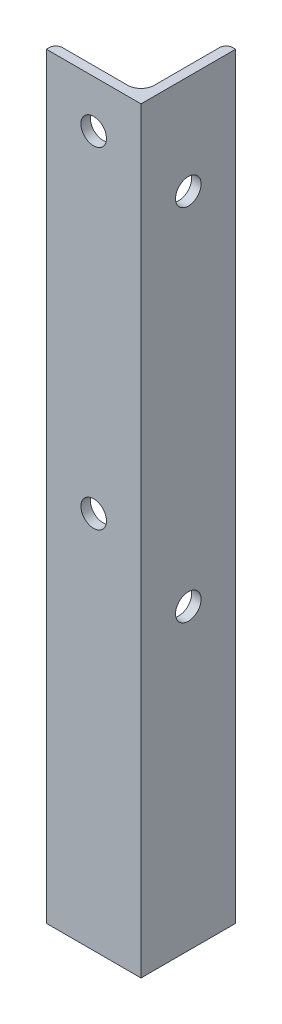
ISO-10303-21;
HEADER;
FILE_DESCRIPTION(('STEP AP214'),'2;1');
FILE_NAME('part.step','',(''),(''),'','','');
FILE_SCHEMA(('AUTOMOTIVE_DESIGN { 1 0 10303 214 1 1 1 1 }'));
ENDSEC;
DATA;
#1=APPLICATION_CONTEXT('core data for automotive mechanical design processes');
#2=APPLICATION_PROTOCOL_DEFINITION('international standard','automotive_design',2000,#1);
#3=PRODUCT_CONTEXT('',#1,'mechanical');
#4=PRODUCT('Part','Part','',(#3));
#5=PRODUCT_RELATED_PRODUCT_CATEGORY('part','',(#4));
#6=PRODUCT_DEFINITION_FORMATION('','',#4);
#7=PRODUCT_DEFINITION_CONTEXT('part definition',#1,'design');
#8=PRODUCT_DEFINITION('design','',#6,#7);
#9=PRODUCT_DEFINITION_SHAPE('','',#8);
#10=(LENGTH_UNIT() NAMED_UNIT(*) SI_UNIT(.MILLI.,.METRE.));
#11=(NAMED_UNIT(*) PLANE_ANGLE_UNIT() SI_UNIT($,.RADIAN.));
#12=(NAMED_UNIT(*) SI_UNIT($,.STERADIAN.) SOLID_ANGLE_UNIT());
#13=UNCERTAINTY_MEASURE_WITH_UNIT(LENGTH_MEASURE(1.E-05),#10,'distance_accuracy_value','');
#14=(GEOMETRIC_REPRESENTATION_CONTEXT(3) GLOBAL_UNCERTAINTY_ASSIGNED_CONTEXT((#13)) GLOBAL_UNIT_ASSIGNED_CONTEXT((#10,
#11,#12)) REPRESENTATION_CONTEXT('',''));
#15=CARTESIAN_POINT('',(0.,0.,0.));
#16=DIRECTION('',(0.,0.,1.));
#17=DIRECTION('',(1.,0.,0.));
#18=AXIS2_PLACEMENT_3D('',#15,#16,#17);
#19=CARTESIAN_POINT('',(0.,200.,0.));
#20=DIRECTION('',(-1.,0.,0.));
#21=DIRECTION('',(0.,0.,-1.));
#22=AXIS2_PLACEMENT_3D('',#19,#20,#21);
#23=PLANE('',#22);
#24=CARTESIAN_POINT('',(0.,147.5,-25.));
#25=DIRECTION('',(-1.,0.,0.));
#26=DIRECTION('',(0.,0.,1.));
#27=AXIS2_PLACEMENT_3D('',#24,#25,#26);
#28=CIRCLE('',#27,6.75);
#29=CARTESIAN_POINT('',(0.,147.5,-18.25));
#30=VERTEX_POINT('',#29);
#31=EDGE_CURVE('E218',#30,#30,#28,.T.);
#32=ORIENTED_EDGE('',*,*,#31,.T.);
#33=EDGE_LOOP('',(#32));
#34=FACE_BOUND('',#33,.T.);
#35=CARTESIAN_POINT('',(0.,-42.5,-25.));
#36=DIRECTION('',(-1.,0.,0.));
#37=DIRECTION('',(0.,0.,1.));
#38=AXIS2_PLACEMENT_3D('',#35,#36,#37);
#39=CIRCLE('',#38,6.75);
#40=CARTESIAN_POINT('',(0.,-42.5,-18.25));
#41=VERTEX_POINT('',#40);
#42=EDGE_CURVE('E221',#41,#41,#39,.T.);
#43=ORIENTED_EDGE('',*,*,#42,.T.);
#44=EDGE_LOOP('',(#43));
#45=FACE_BOUND('',#44,.T.);
#46=DIRECTION('',(0.,0.,1.));
#47=VECTOR('',#46,1.);
#48=CARTESIAN_POINT('',(0.,-200.,0.));
#49=LINE('',#48,#47);
#50=CARTESIAN_POINT('',(0.,-200.,-50.));
#51=VERTEX_POINT('',#50);
#52=CARTESIAN_POINT('',(0.,-200.,0.));
#53=VERTEX_POINT('',#52);
#54=EDGE_CURVE('E137',#51,#53,#49,.T.);
#55=ORIENTED_EDGE('',*,*,#54,.F.);
#56=DIRECTION('',(0.,-1.,0.));
#57=VECTOR('',#56,1.);
#58=CARTESIAN_POINT('',(0.,200.,-50.));
#59=LINE('',#58,#57);
#60=CARTESIAN_POINT('',(0.,200.,-50.));
#61=VERTEX_POINT('',#60);
#62=EDGE_CURVE('E136',#61,#51,#59,.T.);
#63=ORIENTED_EDGE('',*,*,#62,.F.);
#64=DIRECTION('',(0.,0.,1.));
#65=VECTOR('',#64,1.);
#66=CARTESIAN_POINT('',(0.,200.,0.));
#67=LINE('',#66,#65);
#68=CARTESIAN_POINT('',(0.,200.,0.));
#69=VERTEX_POINT('',#68);
#70=EDGE_CURVE('E159',#61,#69,#67,.T.);
#71=ORIENTED_EDGE('',*,*,#70,.T.);
#72=DIRECTION('',(0.,-1.,0.));
#73=VECTOR('',#72,1.);
#74=CARTESIAN_POINT('',(0.,200.,0.));
#75=LINE('',#74,#73);
#76=EDGE_CURVE('E11',#69,#53,#75,.T.);
#77=ORIENTED_EDGE('',*,*,#76,.T.);
#78=EDGE_LOOP('',(#55,#63,#71,#77));
#79=FACE_BOUND('',#78,.T.);
#80=ADVANCED_FACE('F35',(#34,#45,#79),#23,.F.);
#81=CARTESIAN_POINT('',(0.,200.,0.));
#82=DIRECTION('',(0.,0.,-1.));
#83=DIRECTION('',(1.,0.,0.));
#84=AXIS2_PLACEMENT_3D('',#81,#82,#83);
#85=PLANE('',#84);
#86=CARTESIAN_POINT('',(-25.,175.,0.));
#87=DIRECTION('',(0.,0.,-1.));
#88=DIRECTION('',(-1.,0.,0.));
#89=AXIS2_PLACEMENT_3D('',#86,#87,#88);
#90=CIRCLE('',#89,6.75000000000002);
#91=CARTESIAN_POINT('',(-31.75,175.,0.));
#92=VERTEX_POINT('',#91);
#93=EDGE_CURVE('E231',#92,#92,#90,.T.);
#94=ORIENTED_EDGE('',*,*,#93,.T.);
#95=EDGE_LOOP('',(#94));
#96=FACE_BOUND('',#95,.T.);
#97=CARTESIAN_POINT('',(-25.,0.,0.));
#98=DIRECTION('',(0.,0.,-1.));
#99=DIRECTION('',(-1.,0.,0.));
#100=AXIS2_PLACEMENT_3D('',#97,#98,#99);
#101=CIRCLE('',#100,6.75000000000002);
#102=CARTESIAN_POINT('',(-31.75,0.,0.));
#103=VERTEX_POINT('',#102);
#104=EDGE_CURVE('E235',#103,#103,#101,.T.);
#105=ORIENTED_EDGE('',*,*,#104,.T.);
#106=EDGE_LOOP('',(#105));
#107=FACE_BOUND('',#106,.T.);
#108=DIRECTION('',(-1.,0.,0.));
#109=VECTOR('',#108,1.);
#110=CARTESIAN_POINT('',(0.,-200.,0.));
#111=LINE('',#110,#109);
#112=CARTESIAN_POINT('',(-50.,-200.,0.));
#113=VERTEX_POINT('',#112);
#114=EDGE_CURVE('E139',#53,#113,#111,.T.);
#115=ORIENTED_EDGE('',*,*,#114,.F.);
#116=ORIENTED_EDGE('',*,*,#76,.F.);
#117=DIRECTION('',(-1.,0.,0.));
#118=VECTOR('',#117,1.);
#119=CARTESIAN_POINT('',(0.,200.,0.));
#120=LINE('',#119,#118);
#121=CARTESIAN_POINT('',(-50.,200.,0.));
#122=VERTEX_POINT('',#121);
#123=EDGE_CURVE('E92',#69,#122,#120,.T.);
#124=ORIENTED_EDGE('',*,*,#123,.T.);
#125=DIRECTION('',(0.,-1.,0.));
#126=VECTOR('',#125,1.);
#127=CARTESIAN_POINT('',(-50.,200.,0.));
#128=LINE('',#127,#126);
#129=EDGE_CURVE('E43',#122,#113,#128,.T.);
#130=ORIENTED_EDGE('',*,*,#129,.T.);
#131=EDGE_LOOP('',(#115,#116,#124,#130));
#132=FACE_BOUND('',#131,.T.);
#133=ADVANCED_FACE('F174',(#96,#107,#132),#85,.F.);
#134=CARTESIAN_POINT('',(-50.,200.,0.));
#135=DIRECTION('',(1.,0.,0.));
#136=DIRECTION('',(0.,0.,1.));
#137=AXIS2_PLACEMENT_3D('',#134,#135,#136);
#138=PLANE('',#137);
#139=DIRECTION('',(0.,0.,-1.));
#140=VECTOR('',#139,1.);
#141=CARTESIAN_POINT('',(-50.,-200.,0.));
#142=LINE('',#141,#140);
#143=CARTESIAN_POINT('',(-50.,-200.,-1.50000000000001));
#144=VERTEX_POINT('',#143);
#145=EDGE_CURVE('E143',#113,#144,#142,.T.);
#146=ORIENTED_EDGE('',*,*,#145,.F.);
#147=ORIENTED_EDGE('',*,*,#129,.F.);
#148=DIRECTION('',(0.,0.,-1.));
#149=VECTOR('',#148,1.);
#150=CARTESIAN_POINT('',(-50.,200.,0.));
#151=LINE('',#150,#149);
#152=CARTESIAN_POINT('',(-50.,200.,-1.50000000000001));
#153=VERTEX_POINT('',#152);
#154=EDGE_CURVE('E183',#122,#153,#151,.T.);
#155=ORIENTED_EDGE('',*,*,#154,.T.);
#156=DIRECTION('',(0.,-1.,0.));
#157=VECTOR('',#156,1.);
#158=CARTESIAN_POINT('',(-50.,200.,-1.50000000000001));
#159=LINE('',#158,#157);
#160=EDGE_CURVE('E169',#153,#144,#159,.T.);
#161=ORIENTED_EDGE('',*,*,#160,.T.);
#162=EDGE_LOOP('',(#146,#147,#155,#161));
#163=FACE_BOUND('',#162,.T.);
#164=ADVANCED_FACE('F202',(#163),#138,.F.);
#165=CARTESIAN_POINT('',(-46.5,200.,-1.50000000000001));
#166=DIRECTION('',(0.,-1.,0.));
#167=DIRECTION('',(0.,0.,1.));
#168=AXIS2_PLACEMENT_3D('',#165,#166,#167);
#169=CYLINDRICAL_SURFACE('',#168,3.5);
#170=CARTESIAN_POINT('',(-46.5,-200.,-1.50000000000001));
#171=DIRECTION('',(0.,-1.,0.));
#172=DIRECTION('',(0.,0.,-1.));
#173=AXIS2_PLACEMENT_3D('',#170,#171,#172);
#174=CIRCLE('',#173,3.5);
#175=CARTESIAN_POINT('',(-46.5,-200.,-5.00000000000001));
#176=VERTEX_POINT('',#175);
#177=EDGE_CURVE('E146',#144,#176,#174,.T.);
#178=ORIENTED_EDGE('',*,*,#177,.F.);
#179=ORIENTED_EDGE('',*,*,#160,.F.);
#180=CARTESIAN_POINT('',(-46.5,200.,-1.50000000000001));
#181=DIRECTION('',(0.,-1.,0.));
#182=DIRECTION('',(0.,0.,-1.));
#183=AXIS2_PLACEMENT_3D('',#180,#181,#182);
#184=CIRCLE('',#183,3.5);
#185=CARTESIAN_POINT('',(-46.5,200.,-5.00000000000001));
#186=VERTEX_POINT('',#185);
#187=EDGE_CURVE('E190',#153,#186,#184,.T.);
#188=ORIENTED_EDGE('',*,*,#187,.T.);
#189=DIRECTION('',(0.,-1.,0.));
#190=VECTOR('',#189,1.);
#191=CARTESIAN_POINT('',(-46.5,200.,-5.00000000000001));
#192=LINE('',#191,#190);
#193=EDGE_CURVE('E166',#186,#176,#192,.T.);
#194=ORIENTED_EDGE('',*,*,#193,.T.);
#195=EDGE_LOOP('',(#178,#179,#188,#194));
#196=FACE_BOUND('',#195,.T.);
#197=ADVANCED_FACE('F201',(#196),#169,.T.);
#198=CARTESIAN_POINT('',(-46.5,200.,-5.00000000000001));
#199=DIRECTION('',(0.,0.,1.));
#200=DIRECTION('',(-1.,0.,0.));
#201=AXIS2_PLACEMENT_3D('',#198,#199,#200);
#202=PLANE('',#201);
#203=CARTESIAN_POINT('',(-25.,175.,-5.));
#204=DIRECTION('',(0.,0.,-1.));
#205=DIRECTION('',(-1.,0.,0.));
#206=AXIS2_PLACEMENT_3D('',#203,#204,#205);
#207=CIRCLE('',#206,6.75000000000002);
#208=CARTESIAN_POINT('',(-31.75,175.,-5.));
#209=VERTEX_POINT('',#208);
#210=EDGE_CURVE('E140',#209,#209,#207,.F.);
#211=ORIENTED_EDGE('',*,*,#210,.T.);
#212=EDGE_LOOP('',(#211));
#213=FACE_BOUND('',#212,.T.);
#214=CARTESIAN_POINT('',(-25.,0.,-5.));
#215=DIRECTION('',(0.,0.,-1.));
#216=DIRECTION('',(-1.,0.,0.));
#217=AXIS2_PLACEMENT_3D('',#214,#215,#216);
#218=CIRCLE('',#217,6.75000000000002);
#219=CARTESIAN_POINT('',(-31.75,0.,-5.));
#220=VERTEX_POINT('',#219);
#221=EDGE_CURVE('E186',#220,#220,#218,.F.);
#222=ORIENTED_EDGE('',*,*,#221,.T.);
#223=EDGE_LOOP('',(#222));
#224=FACE_BOUND('',#223,.T.);
#225=DIRECTION('',(1.,0.,0.));
#226=VECTOR('',#225,1.);
#227=CARTESIAN_POINT('',(-46.5,-200.,-5.00000000000001));
#228=LINE('',#227,#226);
#229=CARTESIAN_POINT('',(-12.,-200.,-5.00000000000001));
#230=VERTEX_POINT('',#229);
#231=EDGE_CURVE('E149',#176,#230,#228,.T.);
#232=ORIENTED_EDGE('',*,*,#231,.F.);
#233=ORIENTED_EDGE('',*,*,#193,.F.);
#234=DIRECTION('',(1.,0.,0.));
#235=VECTOR('',#234,1.);
#236=CARTESIAN_POINT('',(-46.5,200.,-5.00000000000001));
#237=LINE('',#236,#235);
#238=CARTESIAN_POINT('',(-12.,200.,-5.00000000000001));
#239=VERTEX_POINT('',#238);
#240=EDGE_CURVE('E131',#186,#239,#237,.T.);
#241=ORIENTED_EDGE('',*,*,#240,.T.);
#242=DIRECTION('',(0.,-1.,0.));
#243=VECTOR('',#242,1.);
#244=CARTESIAN_POINT('',(-12.,200.,-5.00000000000001));
#245=LINE('',#244,#243);
#246=EDGE_CURVE('E163',#239,#230,#245,.T.);
#247=ORIENTED_EDGE('',*,*,#246,.T.);
#248=EDGE_LOOP('',(#232,#233,#241,#247));
#249=FACE_BOUND('',#248,.T.);
#250=ADVANCED_FACE('F195',(#213,#224,#249),#202,.F.);
#251=CARTESIAN_POINT('',(-12.,200.,-12.));
#252=DIRECTION('',(0.,-1.,0.));
#253=DIRECTION('',(0.,0.,1.));
#254=AXIS2_PLACEMENT_3D('',#251,#252,#253);
#255=CYLINDRICAL_SURFACE('',#254,7.);
#256=CARTESIAN_POINT('',(-12.,-200.,-12.));
#257=DIRECTION('',(0.,1.,0.));
#258=DIRECTION('',(0.,0.,1.));
#259=AXIS2_PLACEMENT_3D('',#256,#257,#258);
#260=CIRCLE('',#259,7.);
#261=CARTESIAN_POINT('',(-5.,-200.,-12.));
#262=VERTEX_POINT('',#261);
#263=EDGE_CURVE('E152',#230,#262,#260,.T.);
#264=ORIENTED_EDGE('',*,*,#263,.F.);
#265=ORIENTED_EDGE('',*,*,#246,.F.);
#266=CARTESIAN_POINT('',(-12.,200.,-12.));
#267=DIRECTION('',(0.,1.,0.));
#268=DIRECTION('',(0.,0.,1.));
#269=AXIS2_PLACEMENT_3D('',#266,#267,#268);
#270=CIRCLE('',#269,7.);
#271=CARTESIAN_POINT('',(-5.,200.,-12.));
#272=VERTEX_POINT('',#271);
#273=EDGE_CURVE('E129',#239,#272,#270,.T.);
#274=ORIENTED_EDGE('',*,*,#273,.T.);
#275=DIRECTION('',(0.,-1.,0.));
#276=VECTOR('',#275,1.);
#277=CARTESIAN_POINT('',(-5.,200.,-12.));
#278=LINE('',#277,#276);
#279=EDGE_CURVE('E123',#272,#262,#278,.T.);
#280=ORIENTED_EDGE('',*,*,#279,.T.);
#281=EDGE_LOOP('',(#264,#265,#274,#280));
#282=FACE_BOUND('',#281,.T.);
#283=ADVANCED_FACE('F199',(#282),#255,.F.);
#284=CARTESIAN_POINT('',(-4.99999999999999,200.,-46.5));
#285=DIRECTION('',(1.,0.,0.));
#286=DIRECTION('',(0.,0.,1.));
#287=AXIS2_PLACEMENT_3D('',#284,#285,#286);
#288=PLANE('',#287);
#289=CARTESIAN_POINT('',(-5.,147.5,-25.));
#290=DIRECTION('',(-1.,0.,0.));
#291=DIRECTION('',(0.,0.,1.));
#292=AXIS2_PLACEMENT_3D('',#289,#290,#291);
#293=CIRCLE('',#292,6.75);
#294=CARTESIAN_POINT('',(-5.,147.5,-18.25));
#295=VERTEX_POINT('',#294);
#296=EDGE_CURVE('E228',#295,#295,#293,.F.);
#297=ORIENTED_EDGE('',*,*,#296,.T.);
#298=EDGE_LOOP('',(#297));
#299=FACE_BOUND('',#298,.T.);
#300=CARTESIAN_POINT('',(-5.,-42.5,-25.));
#301=DIRECTION('',(-1.,0.,0.));
#302=DIRECTION('',(0.,0.,1.));
#303=AXIS2_PLACEMENT_3D('',#300,#301,#302);
#304=CIRCLE('',#303,6.75);
#305=CARTESIAN_POINT('',(-5.,-42.5,-18.25));
#306=VERTEX_POINT('',#305);
#307=EDGE_CURVE('E223',#306,#306,#304,.F.);
#308=ORIENTED_EDGE('',*,*,#307,.T.);
#309=EDGE_LOOP('',(#308));
#310=FACE_BOUND('',#309,.T.);
#311=DIRECTION('',(0.,0.,-1.));
#312=VECTOR('',#311,1.);
#313=CARTESIAN_POINT('',(-4.99999999999999,-200.,-46.5));
#314=LINE('',#313,#312);
#315=CARTESIAN_POINT('',(-4.99999999999999,-200.,-46.5));
#316=VERTEX_POINT('',#315);
#317=EDGE_CURVE('E155',#262,#316,#314,.T.);
#318=ORIENTED_EDGE('',*,*,#317,.F.);
#319=ORIENTED_EDGE('',*,*,#279,.F.);
#320=DIRECTION('',(0.,0.,-1.));
#321=VECTOR('',#320,1.);
#322=CARTESIAN_POINT('',(-4.99999999999999,200.,-46.5));
#323=LINE('',#322,#321);
#324=CARTESIAN_POINT('',(-4.99999999999999,200.,-46.5));
#325=VERTEX_POINT('',#324);
#326=EDGE_CURVE('E113',#272,#325,#323,.T.);
#327=ORIENTED_EDGE('',*,*,#326,.T.);
#328=DIRECTION('',(0.,-1.,0.));
#329=VECTOR('',#328,1.);
#330=CARTESIAN_POINT('',(-4.99999999999999,200.,-46.5));
#331=LINE('',#330,#329);
#332=EDGE_CURVE('E118',#325,#316,#331,.T.);
#333=ORIENTED_EDGE('',*,*,#332,.T.);
#334=EDGE_LOOP('',(#318,#319,#327,#333));
#335=FACE_BOUND('',#334,.T.);
#336=ADVANCED_FACE('F126',(#299,#310,#335),#288,.F.);
#337=CARTESIAN_POINT('',(-1.49999999999999,200.,-46.5));
#338=DIRECTION('',(0.,-1.,0.));
#339=DIRECTION('',(0.,0.,1.));
#340=AXIS2_PLACEMENT_3D('',#337,#338,#339);
#341=CYLINDRICAL_SURFACE('',#340,3.5);
#342=CARTESIAN_POINT('',(-1.49999999999999,-200.,-46.5));
#343=DIRECTION('',(0.,-1.,0.));
#344=DIRECTION('',(0.,0.,1.));
#345=AXIS2_PLACEMENT_3D('',#342,#343,#344);
#346=CIRCLE('',#345,3.5);
#347=CARTESIAN_POINT('',(-1.49999999999999,-200.,-50.));
#348=VERTEX_POINT('',#347);
#349=EDGE_CURVE('E120',#316,#348,#346,.T.);
#350=ORIENTED_EDGE('',*,*,#349,.F.);
#351=ORIENTED_EDGE('',*,*,#332,.F.);
#352=CARTESIAN_POINT('',(-1.49999999999999,200.,-46.5));
#353=DIRECTION('',(0.,-1.,0.));
#354=DIRECTION('',(0.,0.,1.));
#355=AXIS2_PLACEMENT_3D('',#352,#353,#354);
#356=CIRCLE('',#355,3.5);
#357=CARTESIAN_POINT('',(-1.49999999999999,200.,-50.));
#358=VERTEX_POINT('',#357);
#359=EDGE_CURVE('E109',#325,#358,#356,.T.);
#360=ORIENTED_EDGE('',*,*,#359,.T.);
#361=DIRECTION('',(0.,-1.,0.));
#362=VECTOR('',#361,1.);
#363=CARTESIAN_POINT('',(-1.49999999999999,200.,-50.));
#364=LINE('',#363,#362);
#365=EDGE_CURVE('E124',#358,#348,#364,.T.);
#366=ORIENTED_EDGE('',*,*,#365,.T.);
#367=EDGE_LOOP('',(#350,#351,#360,#366));
#368=FACE_BOUND('',#367,.T.);
#369=ADVANCED_FACE('F119',(#368),#341,.T.);
#370=CARTESIAN_POINT('',(0.,200.,-50.));
#371=DIRECTION('',(0.,0.,1.));
#372=DIRECTION('',(-1.,0.,0.));
#373=AXIS2_PLACEMENT_3D('',#370,#371,#372);
#374=PLANE('',#373);
#375=DIRECTION('',(1.,0.,0.));
#376=VECTOR('',#375,1.);
#377=CARTESIAN_POINT('',(0.,-200.,-50.));
#378=LINE('',#377,#376);
#379=EDGE_CURVE('E80',#348,#51,#378,.T.);
#380=ORIENTED_EDGE('',*,*,#379,.F.);
#381=ORIENTED_EDGE('',*,*,#365,.F.);
#382=DIRECTION('',(1.,0.,0.));
#383=VECTOR('',#382,1.);
#384=CARTESIAN_POINT('',(0.,200.,-50.));
#385=LINE('',#384,#383);
#386=EDGE_CURVE('E51',#358,#61,#385,.T.);
#387=ORIENTED_EDGE('',*,*,#386,.T.);
#388=ORIENTED_EDGE('',*,*,#62,.T.);
#389=EDGE_LOOP('',(#380,#381,#387,#388));
#390=FACE_BOUND('',#389,.T.);
#391=ADVANCED_FACE('F265',(#390),#374,.F.);
#392=CARTESIAN_POINT('',(-1.49999999999999,200.,-46.5));
#393=DIRECTION('',(0.,-1.,0.));
#394=DIRECTION('',(0.,0.,1.));
#395=AXIS2_PLACEMENT_3D('',#392,#393,#394);
#396=PLANE('',#395);
#397=ORIENTED_EDGE('',*,*,#70,.F.);
#398=ORIENTED_EDGE('',*,*,#386,.F.);
#399=ORIENTED_EDGE('',*,*,#359,.F.);
#400=ORIENTED_EDGE('',*,*,#326,.F.);
#401=ORIENTED_EDGE('',*,*,#273,.F.);
#402=ORIENTED_EDGE('',*,*,#240,.F.);
#403=ORIENTED_EDGE('',*,*,#187,.F.);
#404=ORIENTED_EDGE('',*,*,#154,.F.);
#405=ORIENTED_EDGE('',*,*,#123,.F.);
#406=EDGE_LOOP('',(#397,#398,#399,#400,#401,#402,#403,#404,#405));
#407=FACE_BOUND('',#406,.T.);
#408=ADVANCED_FACE('F111',(#407),#396,.F.);
#409=CARTESIAN_POINT('',(-1.49999999999999,-200.,-46.5));
#410=DIRECTION('',(0.,-1.,0.));
#411=DIRECTION('',(0.,0.,1.));
#412=AXIS2_PLACEMENT_3D('',#409,#410,#411);
#413=PLANE('',#412);
#414=ORIENTED_EDGE('',*,*,#54,.T.);
#415=ORIENTED_EDGE('',*,*,#114,.T.);
#416=ORIENTED_EDGE('',*,*,#145,.T.);
#417=ORIENTED_EDGE('',*,*,#177,.T.);
#418=ORIENTED_EDGE('',*,*,#231,.T.);
#419=ORIENTED_EDGE('',*,*,#263,.T.);
#420=ORIENTED_EDGE('',*,*,#317,.T.);
#421=ORIENTED_EDGE('',*,*,#349,.T.);
#422=ORIENTED_EDGE('',*,*,#379,.T.);
#423=EDGE_LOOP('',(#414,#415,#416,#417,#418,#419,#420,#421,#422));
#424=FACE_BOUND('',#423,.T.);
#425=ADVANCED_FACE('F177',(#424),#413,.T.);
#426=CARTESIAN_POINT('',(-25.,0.,-50.001));
#427=DIRECTION('',(0.,0.,1.));
#428=DIRECTION('',(-1.,0.,0.));
#429=AXIS2_PLACEMENT_3D('',#426,#427,#428);
#430=CYLINDRICAL_SURFACE('',#429,6.75000000000002);
#431=ORIENTED_EDGE('',*,*,#104,.F.);
#432=EDGE_LOOP('',(#431));
#433=FACE_BOUND('',#432,.T.);
#434=ORIENTED_EDGE('',*,*,#221,.F.);
#435=EDGE_LOOP('',(#434));
#436=FACE_BOUND('',#435,.T.);
#437=ADVANCED_FACE('F258',(#433,#436),#430,.F.);
#438=CARTESIAN_POINT('',(-25.,175.,-50.001));
#439=DIRECTION('',(0.,0.,1.));
#440=DIRECTION('',(-1.,0.,0.));
#441=AXIS2_PLACEMENT_3D('',#438,#439,#440);
#442=CYLINDRICAL_SURFACE('',#441,6.75000000000002);
#443=ORIENTED_EDGE('',*,*,#93,.F.);
#444=EDGE_LOOP('',(#443));
#445=FACE_BOUND('',#444,.T.);
#446=ORIENTED_EDGE('',*,*,#210,.F.);
#447=EDGE_LOOP('',(#446));
#448=FACE_BOUND('',#447,.T.);
#449=ADVANCED_FACE('F253',(#445,#448),#442,.F.);
#450=CARTESIAN_POINT('',(-50.001,-42.5,-25.));
#451=DIRECTION('',(1.,0.,0.));
#452=DIRECTION('',(0.,0.,1.));
#453=AXIS2_PLACEMENT_3D('',#450,#451,#452);
#454=CYLINDRICAL_SURFACE('',#453,6.75);
#455=ORIENTED_EDGE('',*,*,#42,.F.);
#456=EDGE_LOOP('',(#455));
#457=FACE_BOUND('',#456,.T.);
#458=ORIENTED_EDGE('',*,*,#307,.F.);
#459=EDGE_LOOP('',(#458));
#460=FACE_BOUND('',#459,.T.);
#461=ADVANCED_FACE('F247',(#457,#460),#454,.F.);
#462=CARTESIAN_POINT('',(-50.001,147.5,-25.));
#463=DIRECTION('',(1.,0.,0.));
#464=DIRECTION('',(0.,0.,1.));
#465=AXIS2_PLACEMENT_3D('',#462,#463,#464);
#466=CYLINDRICAL_SURFACE('',#465,6.75);
#467=ORIENTED_EDGE('',*,*,#31,.F.);
#468=EDGE_LOOP('',(#467));
#469=FACE_BOUND('',#468,.T.);
#470=ORIENTED_EDGE('',*,*,#296,.F.);
#471=EDGE_LOOP('',(#470));
#472=FACE_BOUND('',#471,.T.);
#473=ADVANCED_FACE('F245',(#469,#472),#466,.F.);
#474=CLOSED_SHELL('',(#80,#133,#164,#197,#250,#283,#336,#369,#391,#408,#425,#437,#449,#461,#473));
#475=MANIFOLD_SOLID_BREP('B2',#474);
#476=ADVANCED_BREP_SHAPE_REPRESENTATION('',(#18,#475),#14);
#477=SHAPE_DEFINITION_REPRESENTATION(#9,#476);
ENDSEC;
END-ISO-10303-21;
